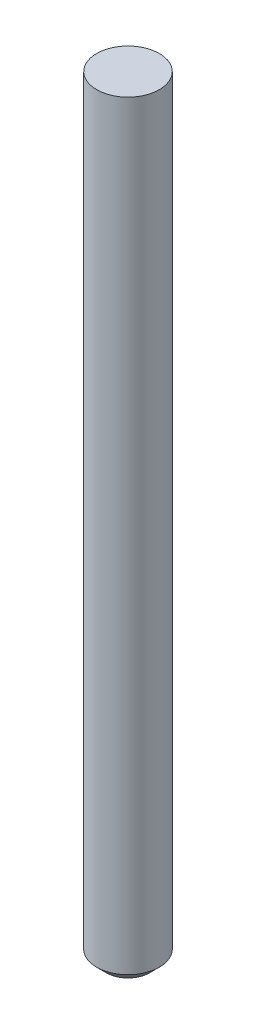
ISO-10303-21;
HEADER;
FILE_DESCRIPTION(('STEP AP214'),'2;1');
FILE_NAME('part.step','',(''),(''),'','','');
FILE_SCHEMA(('AUTOMOTIVE_DESIGN { 1 0 10303 214 1 1 1 1 }'));
ENDSEC;
DATA;
#1=APPLICATION_CONTEXT('core data for automotive mechanical design processes');
#2=APPLICATION_PROTOCOL_DEFINITION('international standard','automotive_design',2000,#1);
#3=PRODUCT_CONTEXT('',#1,'mechanical');
#4=PRODUCT('Part','Part','',(#3));
#5=PRODUCT_RELATED_PRODUCT_CATEGORY('part','',(#4));
#6=PRODUCT_DEFINITION_FORMATION('','',#4);
#7=PRODUCT_DEFINITION_CONTEXT('part definition',#1,'design');
#8=PRODUCT_DEFINITION('design','',#6,#7);
#9=PRODUCT_DEFINITION_SHAPE('','',#8);
#10=(LENGTH_UNIT() NAMED_UNIT(*) SI_UNIT(.MILLI.,.METRE.));
#11=(NAMED_UNIT(*) PLANE_ANGLE_UNIT() SI_UNIT($,.RADIAN.));
#12=(NAMED_UNIT(*) SI_UNIT($,.STERADIAN.) SOLID_ANGLE_UNIT());
#13=UNCERTAINTY_MEASURE_WITH_UNIT(LENGTH_MEASURE(1.E-05),#10,'distance_accuracy_value','');
#14=(GEOMETRIC_REPRESENTATION_CONTEXT(3) GLOBAL_UNCERTAINTY_ASSIGNED_CONTEXT((#13)) GLOBAL_UNIT_ASSIGNED_CONTEXT((#10,
#11,#12)) REPRESENTATION_CONTEXT('',''));
#15=CARTESIAN_POINT('',(0.,0.,0.));
#16=DIRECTION('',(0.,0.,1.));
#17=DIRECTION('',(1.,0.,0.));
#18=AXIS2_PLACEMENT_3D('',#15,#16,#17);
#19=CARTESIAN_POINT('',(-22.,-15.12,-35.8));
#20=DIRECTION('',(0.,1.,0.));
#21=DIRECTION('',(0.,0.,-1.));
#22=AXIS2_PLACEMENT_3D('',#19,#20,#21);
#23=CONICAL_SURFACE('',#22,0.55,0.7853981634);
#24=CARTESIAN_POINT('',(-22.,-15.02,-35.8));
#25=DIRECTION('',(0.,-1.,0.));
#26=DIRECTION('',(0.,0.,-1.));
#27=AXIS2_PLACEMENT_3D('',#24,#25,#26);
#28=CIRCLE('',#27,0.65);
#29=CARTESIAN_POINT('',(-22.,-15.02,-35.15));
#30=VERTEX_POINT('',#29);
#31=EDGE_CURVE('E11',#30,#30,#28,.T.);
#32=ORIENTED_EDGE('',*,*,#31,.T.);
#33=CARTESIAN_POINT('',(-22.,-15.22,-35.35));
#34=CARTESIAN_POINT('',(-22.,-15.02,-35.15));
#35=B_SPLINE_CURVE_WITH_KNOTS('',1,(#33,#34),.UNSPECIFIED.,.F.,.F.,(2,2),(-0.141421356237309,
0.141421356237308),.UNSPECIFIED.);
#36=CARTESIAN_POINT('',(-22.,-15.22,-35.35));
#37=VERTEX_POINT('',#36);
#38=EDGE_CURVE('E24',#37,#30,#35,.T.);
#39=ORIENTED_EDGE('',*,*,#38,.F.);
#40=CARTESIAN_POINT('',(-22.,-15.22,-35.8));
#41=DIRECTION('',(0.,1.,0.));
#42=DIRECTION('',(0.,0.,-1.));
#43=AXIS2_PLACEMENT_3D('',#40,#41,#42);
#44=CIRCLE('',#43,0.45);
#45=EDGE_CURVE('E42',#37,#37,#44,.T.);
#46=ORIENTED_EDGE('',*,*,#45,.T.);
#47=ORIENTED_EDGE('',*,*,#38,.T.);
#48=EDGE_LOOP('',(#32,#39,#46,#47));
#49=FACE_BOUND('',#48,.T.);
#50=ADVANCED_FACE('F17',(#49),#23,.T.);
#51=CARTESIAN_POINT('',(-22.,1.35,-35.8));
#52=DIRECTION('',(0.,-1.,0.));
#53=DIRECTION('',(0.,0.,-1.));
#54=AXIS2_PLACEMENT_3D('',#51,#52,#53);
#55=CYLINDRICAL_SURFACE('',#54,0.65);
#56=CARTESIAN_POINT('',(-22.,0.75,-35.8));
#57=DIRECTION('',(0.,-1.,0.));
#58=DIRECTION('',(0.,0.,-1.));
#59=AXIS2_PLACEMENT_3D('',#56,#57,#58);
#60=CIRCLE('',#59,0.65);
#61=CARTESIAN_POINT('',(-22.,0.75,-35.15));
#62=VERTEX_POINT('',#61);
#63=EDGE_CURVE('E38',#62,#62,#60,.T.);
#64=ORIENTED_EDGE('',*,*,#63,.T.);
#65=CARTESIAN_POINT('',(-22.,0.75,-35.15));
#66=CARTESIAN_POINT('',(-22.,-15.02,-35.15));
#67=B_SPLINE_CURVE_WITH_KNOTS('',1,(#65,#66),.UNSPECIFIED.,.F.,.F.,(2,2),(0.6,16.37),.UNSPECIFIED.);
#68=EDGE_CURVE('E40',#62,#30,#67,.T.);
#69=ORIENTED_EDGE('',*,*,#68,.T.);
#70=ORIENTED_EDGE('',*,*,#31,.F.);
#71=ORIENTED_EDGE('',*,*,#68,.F.);
#72=EDGE_LOOP('',(#64,#69,#70,#71));
#73=FACE_BOUND('',#72,.T.);
#74=ADVANCED_FACE('F39',(#73),#55,.T.);
#75=CARTESIAN_POINT('',(-22.,-15.22,-35.8));
#76=DIRECTION('',(0.,-1.,0.));
#77=DIRECTION('',(0.,0.,-1.));
#78=AXIS2_PLACEMENT_3D('',#75,#76,#77);
#79=PLANE('',#78);
#80=ORIENTED_EDGE('',*,*,#45,.F.);
#81=EDGE_LOOP('',(#80));
#82=FACE_BOUND('',#81,.T.);
#83=ADVANCED_FACE('F55',(#82),#79,.T.);
#84=CARTESIAN_POINT('',(24.43110368616,0.750000000000001,-35.15));
#85=DIRECTION('',(0.,1.,0.));
#86=DIRECTION('',(0.,0.,-1.));
#87=AXIS2_PLACEMENT_3D('',#84,#85,#86);
#88=PLANE('',#87);
#89=ORIENTED_EDGE('',*,*,#63,.F.);
#90=EDGE_LOOP('',(#89));
#91=FACE_BOUND('',#90,.T.);
#92=ADVANCED_FACE('F57',(#91),#88,.T.);
#93=CLOSED_SHELL('',(#50,#74,#83,#92));
#94=MANIFOLD_SOLID_BREP('B1',#93);
#95=ADVANCED_BREP_SHAPE_REPRESENTATION('',(#18,#94),#14);
#96=SHAPE_DEFINITION_REPRESENTATION(#9,#95);
ENDSEC;
END-ISO-10303-21;
